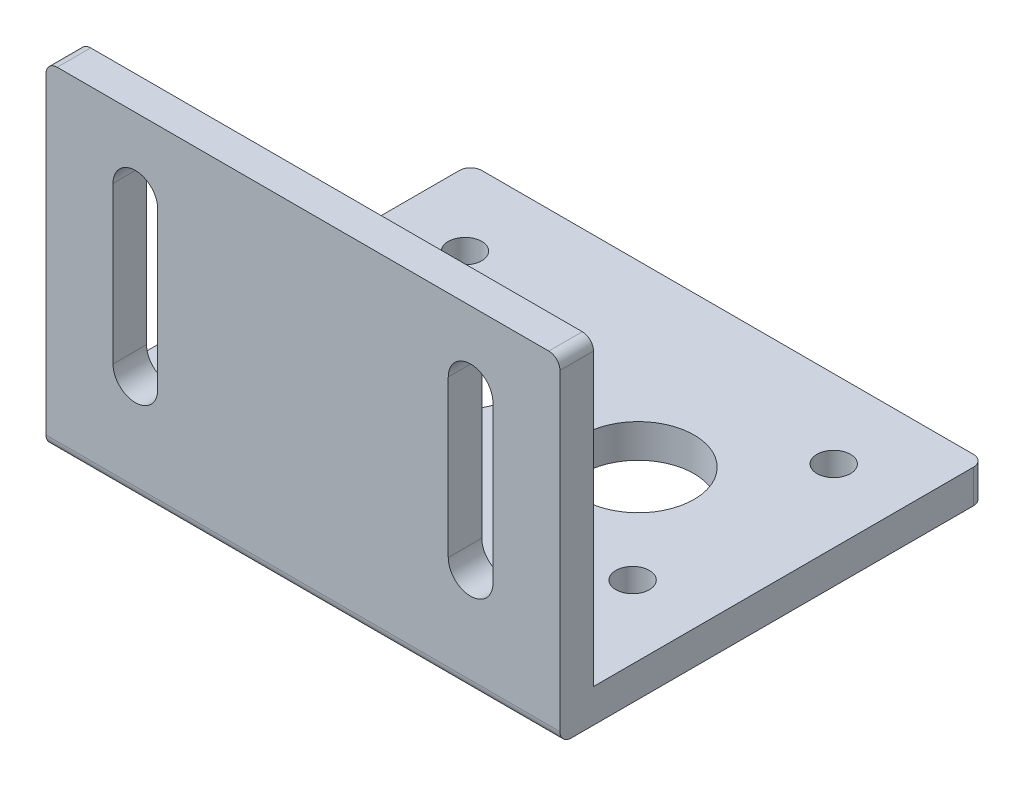
ISO-10303-21;
HEADER;
FILE_DESCRIPTION(('STEP AP214'),'2;1');
FILE_NAME('part.step','',(''),(''),'','','');
FILE_SCHEMA(('AUTOMOTIVE_DESIGN { 1 0 10303 214 1 1 1 1 }'));
ENDSEC;
DATA;
#1=APPLICATION_CONTEXT('core data for automotive mechanical design processes');
#2=APPLICATION_PROTOCOL_DEFINITION('international standard','automotive_design',2000,#1);
#3=PRODUCT_CONTEXT('',#1,'mechanical');
#4=PRODUCT('Part','Part','',(#3));
#5=PRODUCT_RELATED_PRODUCT_CATEGORY('part','',(#4));
#6=PRODUCT_DEFINITION_FORMATION('','',#4);
#7=PRODUCT_DEFINITION_CONTEXT('part definition',#1,'design');
#8=PRODUCT_DEFINITION('design','',#6,#7);
#9=PRODUCT_DEFINITION_SHAPE('','',#8);
#10=(LENGTH_UNIT() NAMED_UNIT(*) SI_UNIT(.MILLI.,.METRE.));
#11=(NAMED_UNIT(*) PLANE_ANGLE_UNIT() SI_UNIT($,.RADIAN.));
#12=(NAMED_UNIT(*) SI_UNIT($,.STERADIAN.) SOLID_ANGLE_UNIT());
#13=UNCERTAINTY_MEASURE_WITH_UNIT(LENGTH_MEASURE(1.E-05),#10,'distance_accuracy_value','');
#14=(GEOMETRIC_REPRESENTATION_CONTEXT(3) GLOBAL_UNCERTAINTY_ASSIGNED_CONTEXT((#13)) GLOBAL_UNIT_ASSIGNED_CONTEXT((#10,
#11,#12)) REPRESENTATION_CONTEXT('',''));
#15=CARTESIAN_POINT('',(0.,0.,0.));
#16=DIRECTION('',(0.,0.,1.));
#17=DIRECTION('',(1.,0.,0.));
#18=AXIS2_PLACEMENT_3D('',#15,#16,#17);
#19=CARTESIAN_POINT('',(-22.,3.,-18.));
#20=DIRECTION('',(0.,1.,0.));
#21=DIRECTION('',(0.,0.,1.));
#22=AXIS2_PLACEMENT_3D('',#19,#20,#21);
#23=PLANE('',#22);
#24=DIRECTION('',(-1.,0.,0.));
#25=VECTOR('',#24,1.);
#26=CARTESIAN_POINT('',(-23.,3.,16.));
#27=LINE('',#26,#25);
#28=CARTESIAN_POINT('',(23.,3.,16.));
#29=VERTEX_POINT('',#28);
#30=CARTESIAN_POINT('',(-23.,3.,16.));
#31=VERTEX_POINT('',#30);
#32=EDGE_CURVE('E204',#29,#31,#27,.T.);
#33=ORIENTED_EDGE('',*,*,#32,.F.);
#34=DIRECTION('',(0.,0.,-1.));
#35=VECTOR('',#34,1.);
#36=CARTESIAN_POINT('',(23.,3.,-18.));
#37=LINE('',#36,#35);
#38=CARTESIAN_POINT('',(23.,3.,-18.));
#39=VERTEX_POINT('',#38);
#40=EDGE_CURVE('E288',#29,#39,#37,.T.);
#41=ORIENTED_EDGE('',*,*,#40,.T.);
#42=CARTESIAN_POINT('',(22.,3.,-18.));
#43=DIRECTION('',(0.,1.,0.));
#44=DIRECTION('',(0.,0.,1.));
#45=AXIS2_PLACEMENT_3D('',#42,#43,#44);
#46=CIRCLE('',#45,1.00000000000001);
#47=CARTESIAN_POINT('',(22.,3.,-19.));
#48=VERTEX_POINT('',#47);
#49=EDGE_CURVE('E290',#39,#48,#46,.T.);
#50=ORIENTED_EDGE('',*,*,#49,.T.);
#51=DIRECTION('',(-1.,0.,0.));
#52=VECTOR('',#51,1.);
#53=CARTESIAN_POINT('',(-22.,3.,-19.));
#54=LINE('',#53,#52);
#55=CARTESIAN_POINT('',(-22.,3.,-19.));
#56=VERTEX_POINT('',#55);
#57=EDGE_CURVE('E293',#48,#56,#54,.T.);
#58=ORIENTED_EDGE('',*,*,#57,.T.);
#59=CARTESIAN_POINT('',(-22.,3.,-18.));
#60=DIRECTION('',(0.,1.,0.));
#61=DIRECTION('',(0.,0.,1.));
#62=AXIS2_PLACEMENT_3D('',#59,#60,#61);
#63=CIRCLE('',#62,1.00000000000001);
#64=CARTESIAN_POINT('',(-23.,3.,-18.));
#65=VERTEX_POINT('',#64);
#66=EDGE_CURVE('E295',#56,#65,#63,.T.);
#67=ORIENTED_EDGE('',*,*,#66,.T.);
#68=DIRECTION('',(0.,0.,1.));
#69=VECTOR('',#68,1.);
#70=CARTESIAN_POINT('',(-23.,3.,-18.));
#71=LINE('',#70,#69);
#72=EDGE_CURVE('E297',#65,#31,#71,.T.);
#73=ORIENTED_EDGE('',*,*,#72,.T.);
#74=EDGE_LOOP('',(#33,#41,#50,#58,#67,#73));
#75=FACE_BOUND('',#74,.T.);
#76=CARTESIAN_POINT('',(16.5,3.,5.99999999999998));
#77=DIRECTION('',(0.,1.,0.));
#78=DIRECTION('',(0.,0.,1.));
#79=AXIS2_PLACEMENT_3D('',#76,#77,#78);
#80=CIRCLE('',#79,1.5);
#81=CARTESIAN_POINT('',(16.5,3.,7.49999999999998));
#82=VERTEX_POINT('',#81);
#83=EDGE_CURVE('E258',#82,#82,#80,.T.);
#84=ORIENTED_EDGE('',*,*,#83,.F.);
#85=EDGE_LOOP('',(#84));
#86=FACE_BOUND('',#85,.T.);
#87=CARTESIAN_POINT('',(-16.5,3.,-12.));
#88=DIRECTION('',(0.,1.,0.));
#89=DIRECTION('',(0.,0.,1.));
#90=AXIS2_PLACEMENT_3D('',#87,#88,#89);
#91=CIRCLE('',#90,1.5);
#92=CARTESIAN_POINT('',(-16.5,3.,-10.5));
#93=VERTEX_POINT('',#92);
#94=EDGE_CURVE('E270',#93,#93,#91,.T.);
#95=ORIENTED_EDGE('',*,*,#94,.F.);
#96=EDGE_LOOP('',(#95));
#97=FACE_BOUND('',#96,.T.);
#98=CARTESIAN_POINT('',(8.00000000000001,3.,-3.00000000000003));
#99=DIRECTION('',(0.,1.,0.));
#100=DIRECTION('',(0.,0.,1.));
#101=AXIS2_PLACEMENT_3D('',#98,#99,#100);
#102=CIRCLE('',#101,5.);
#103=CARTESIAN_POINT('',(8.00000000000001,3.,1.99999999999997));
#104=VERTEX_POINT('',#103);
#105=EDGE_CURVE('E282',#104,#104,#102,.T.);
#106=ORIENTED_EDGE('',*,*,#105,.F.);
#107=EDGE_LOOP('',(#106));
#108=FACE_BOUND('',#107,.T.);
#109=CARTESIAN_POINT('',(-8.,3.,-3.00000000000003));
#110=DIRECTION('',(0.,1.,0.));
#111=DIRECTION('',(0.,0.,-1.));
#112=AXIS2_PLACEMENT_3D('',#109,#110,#111);
#113=CIRCLE('',#112,5.);
#114=CARTESIAN_POINT('',(-8.,3.,-8.00000000000003));
#115=VERTEX_POINT('',#114);
#116=EDGE_CURVE('E276',#115,#115,#113,.T.);
#117=ORIENTED_EDGE('',*,*,#116,.F.);
#118=EDGE_LOOP('',(#117));
#119=FACE_BOUND('',#118,.T.);
#120=CARTESIAN_POINT('',(-16.5,3.,5.99999999999998));
#121=DIRECTION('',(0.,1.,0.));
#122=DIRECTION('',(0.,0.,-1.));
#123=AXIS2_PLACEMENT_3D('',#120,#121,#122);
#124=CIRCLE('',#123,1.5);
#125=CARTESIAN_POINT('',(-16.5,3.,4.49999999999998));
#126=VERTEX_POINT('',#125);
#127=EDGE_CURVE('E264',#126,#126,#124,.T.);
#128=ORIENTED_EDGE('',*,*,#127,.F.);
#129=EDGE_LOOP('',(#128));
#130=FACE_BOUND('',#129,.T.);
#131=CARTESIAN_POINT('',(16.5,3.,-12.));
#132=DIRECTION('',(0.,1.,0.));
#133=DIRECTION('',(0.,0.,-1.));
#134=AXIS2_PLACEMENT_3D('',#131,#132,#133);
#135=CIRCLE('',#134,1.5);
#136=CARTESIAN_POINT('',(16.5,3.,-13.5));
#137=VERTEX_POINT('',#136);
#138=EDGE_CURVE('E252',#137,#137,#135,.T.);
#139=ORIENTED_EDGE('',*,*,#138,.F.);
#140=EDGE_LOOP('',(#139));
#141=FACE_BOUND('',#140,.T.);
#142=ADVANCED_FACE('F33',(#75,#86,#97,#108,#119,#130,#141),#23,.T.);
#143=CARTESIAN_POINT('',(-22.,0.,-18.));
#144=DIRECTION('',(0.,1.,0.));
#145=DIRECTION('',(0.,0.,1.));
#146=AXIS2_PLACEMENT_3D('',#143,#144,#145);
#147=PLANE('',#146);
#148=DIRECTION('',(0.,0.,-1.));
#149=VECTOR('',#148,1.);
#150=CARTESIAN_POINT('',(23.,0.,-18.));
#151=LINE('',#150,#149);
#152=CARTESIAN_POINT('',(23.,0.,18.));
#153=VERTEX_POINT('',#152);
#154=CARTESIAN_POINT('',(23.,0.,-18.));
#155=VERTEX_POINT('',#154);
#156=EDGE_CURVE('E285',#153,#155,#151,.T.);
#157=ORIENTED_EDGE('',*,*,#156,.F.);
#158=DIRECTION('',(1.,0.,0.));
#159=VECTOR('',#158,1.);
#160=CARTESIAN_POINT('',(-22.,0.,18.));
#161=LINE('',#160,#159);
#162=CARTESIAN_POINT('',(-23.,0.,18.));
#163=VERTEX_POINT('',#162);
#164=EDGE_CURVE('E41',#153,#163,#161,.F.);
#165=ORIENTED_EDGE('',*,*,#164,.T.);
#166=DIRECTION('',(0.,0.,1.));
#167=VECTOR('',#166,1.);
#168=CARTESIAN_POINT('',(-23.,0.,-18.));
#169=LINE('',#168,#167);
#170=CARTESIAN_POINT('',(-23.,0.,-18.));
#171=VERTEX_POINT('',#170);
#172=EDGE_CURVE('E291',#171,#163,#169,.T.);
#173=ORIENTED_EDGE('',*,*,#172,.F.);
#174=CARTESIAN_POINT('',(-22.,0.,-18.));
#175=DIRECTION('',(0.,1.,0.));
#176=DIRECTION('',(0.,0.,1.));
#177=AXIS2_PLACEMENT_3D('',#174,#175,#176);
#178=CIRCLE('',#177,1.00000000000001);
#179=CARTESIAN_POINT('',(-22.,0.,-19.));
#180=VERTEX_POINT('',#179);
#181=EDGE_CURVE('E306',#180,#171,#178,.T.);
#182=ORIENTED_EDGE('',*,*,#181,.F.);
#183=DIRECTION('',(-1.,0.,0.));
#184=VECTOR('',#183,1.);
#185=CARTESIAN_POINT('',(-22.,0.,-19.));
#186=LINE('',#185,#184);
#187=CARTESIAN_POINT('',(22.,0.,-19.));
#188=VERTEX_POINT('',#187);
#189=EDGE_CURVE('E304',#188,#180,#186,.T.);
#190=ORIENTED_EDGE('',*,*,#189,.F.);
#191=CARTESIAN_POINT('',(22.,0.,-18.));
#192=DIRECTION('',(0.,1.,0.));
#193=DIRECTION('',(0.,0.,1.));
#194=AXIS2_PLACEMENT_3D('',#191,#192,#193);
#195=CIRCLE('',#194,1.00000000000001);
#196=EDGE_CURVE('E302',#155,#188,#195,.T.);
#197=ORIENTED_EDGE('',*,*,#196,.F.);
#198=EDGE_LOOP('',(#157,#165,#173,#182,#190,#197));
#199=FACE_BOUND('',#198,.T.);
#200=CARTESIAN_POINT('',(8.00000000000001,0.,-3.00000000000003));
#201=DIRECTION('',(0.,1.,0.));
#202=DIRECTION('',(0.,0.,1.));
#203=AXIS2_PLACEMENT_3D('',#200,#201,#202);
#204=CIRCLE('',#203,5.);
#205=CARTESIAN_POINT('',(8.00000000000001,0.,1.99999999999997));
#206=VERTEX_POINT('',#205);
#207=EDGE_CURVE('E279',#206,#206,#204,.T.);
#208=ORIENTED_EDGE('',*,*,#207,.T.);
#209=EDGE_LOOP('',(#208));
#210=FACE_BOUND('',#209,.T.);
#211=CARTESIAN_POINT('',(-8.,0.,-3.00000000000003));
#212=DIRECTION('',(0.,1.,0.));
#213=DIRECTION('',(0.,0.,-1.));
#214=AXIS2_PLACEMENT_3D('',#211,#212,#213);
#215=CIRCLE('',#214,5.);
#216=CARTESIAN_POINT('',(-8.,0.,-8.00000000000003));
#217=VERTEX_POINT('',#216);
#218=EDGE_CURVE('E273',#217,#217,#215,.T.);
#219=ORIENTED_EDGE('',*,*,#218,.T.);
#220=EDGE_LOOP('',(#219));
#221=FACE_BOUND('',#220,.T.);
#222=CARTESIAN_POINT('',(-16.5,0.,-12.));
#223=DIRECTION('',(0.,1.,0.));
#224=DIRECTION('',(0.,0.,1.));
#225=AXIS2_PLACEMENT_3D('',#222,#223,#224);
#226=CIRCLE('',#225,1.5);
#227=CARTESIAN_POINT('',(-16.5,0.,-10.5));
#228=VERTEX_POINT('',#227);
#229=EDGE_CURVE('E267',#228,#228,#226,.T.);
#230=ORIENTED_EDGE('',*,*,#229,.T.);
#231=EDGE_LOOP('',(#230));
#232=FACE_BOUND('',#231,.T.);
#233=CARTESIAN_POINT('',(-16.5,0.,5.99999999999998));
#234=DIRECTION('',(0.,1.,0.));
#235=DIRECTION('',(0.,0.,-1.));
#236=AXIS2_PLACEMENT_3D('',#233,#234,#235);
#237=CIRCLE('',#236,1.5);
#238=CARTESIAN_POINT('',(-16.5,0.,4.49999999999998));
#239=VERTEX_POINT('',#238);
#240=EDGE_CURVE('E261',#239,#239,#237,.T.);
#241=ORIENTED_EDGE('',*,*,#240,.T.);
#242=EDGE_LOOP('',(#241));
#243=FACE_BOUND('',#242,.T.);
#244=CARTESIAN_POINT('',(16.5,0.,5.99999999999998));
#245=DIRECTION('',(0.,1.,0.));
#246=DIRECTION('',(0.,0.,1.));
#247=AXIS2_PLACEMENT_3D('',#244,#245,#246);
#248=CIRCLE('',#247,1.5);
#249=CARTESIAN_POINT('',(16.5,0.,7.49999999999998));
#250=VERTEX_POINT('',#249);
#251=EDGE_CURVE('E255',#250,#250,#248,.T.);
#252=ORIENTED_EDGE('',*,*,#251,.T.);
#253=EDGE_LOOP('',(#252));
#254=FACE_BOUND('',#253,.T.);
#255=CARTESIAN_POINT('',(16.5,0.,-12.));
#256=DIRECTION('',(0.,1.,0.));
#257=DIRECTION('',(0.,0.,-1.));
#258=AXIS2_PLACEMENT_3D('',#255,#256,#257);
#259=CIRCLE('',#258,1.5);
#260=CARTESIAN_POINT('',(16.5,0.,-13.5));
#261=VERTEX_POINT('',#260);
#262=EDGE_CURVE('E251',#261,#261,#259,.T.);
#263=ORIENTED_EDGE('',*,*,#262,.T.);
#264=EDGE_LOOP('',(#263));
#265=FACE_BOUND('',#264,.T.);
#266=ADVANCED_FACE('F377',(#199,#210,#221,#232,#243,#254,#265),#147,.F.);
#267=CARTESIAN_POINT('',(23.,3.,-18.));
#268=DIRECTION('',(-1.,0.,0.));
#269=DIRECTION('',(0.,0.,1.));
#270=AXIS2_PLACEMENT_3D('',#267,#268,#269);
#271=PLANE('',#270);
#272=DIRECTION('',(0.,-1.,0.));
#273=VECTOR('',#272,1.);
#274=CARTESIAN_POINT('',(23.,3.,19.));
#275=LINE('',#274,#273);
#276=CARTESIAN_POINT('',(23.,29.,19.));
#277=VERTEX_POINT('',#276);
#278=CARTESIAN_POINT('',(23.,1.,19.));
#279=VERTEX_POINT('',#278);
#280=EDGE_CURVE('E300',#277,#279,#275,.T.);
#281=ORIENTED_EDGE('',*,*,#280,.T.);
#282=CARTESIAN_POINT('',(23.,1.,18.));
#283=DIRECTION('',(-1.,0.,0.));
#284=DIRECTION('',(0.,0.,1.));
#285=AXIS2_PLACEMENT_3D('',#282,#283,#284);
#286=CIRCLE('',#285,1.);
#287=EDGE_CURVE('E55',#279,#153,#286,.F.);
#288=ORIENTED_EDGE('',*,*,#287,.T.);
#289=ORIENTED_EDGE('',*,*,#156,.T.);
#290=DIRECTION('',(0.,-1.,0.));
#291=VECTOR('',#290,1.);
#292=CARTESIAN_POINT('',(23.,3.,-18.));
#293=LINE('',#292,#291);
#294=EDGE_CURVE('E322',#39,#155,#293,.T.);
#295=ORIENTED_EDGE('',*,*,#294,.F.);
#296=ORIENTED_EDGE('',*,*,#40,.F.);
#297=DIRECTION('',(0.,-1.,0.));
#298=VECTOR('',#297,1.);
#299=CARTESIAN_POINT('',(23.,30.,16.));
#300=LINE('',#299,#298);
#301=CARTESIAN_POINT('',(23.,29.,16.));
#302=VERTEX_POINT('',#301);
#303=EDGE_CURVE('E249',#302,#29,#300,.T.);
#304=ORIENTED_EDGE('',*,*,#303,.F.);
#305=DIRECTION('',(0.,0.,-1.));
#306=VECTOR('',#305,1.);
#307=CARTESIAN_POINT('',(23.,29.,-18.));
#308=LINE('',#307,#306);
#309=EDGE_CURVE('E341',#302,#277,#308,.F.);
#310=ORIENTED_EDGE('',*,*,#309,.T.);
#311=EDGE_LOOP('',(#281,#288,#289,#295,#296,#304,#310));
#312=FACE_BOUND('',#311,.T.);
#313=ADVANCED_FACE('F353',(#312),#271,.F.);
#314=CARTESIAN_POINT('',(22.,3.,-18.));
#315=DIRECTION('',(0.,-1.,0.));
#316=DIRECTION('',(0.,0.,-1.));
#317=AXIS2_PLACEMENT_3D('',#314,#315,#316);
#318=CYLINDRICAL_SURFACE('',#317,1.00000000000001);
#319=ORIENTED_EDGE('',*,*,#196,.T.);
#320=DIRECTION('',(0.,-1.,0.));
#321=VECTOR('',#320,1.);
#322=CARTESIAN_POINT('',(22.,3.,-19.));
#323=LINE('',#322,#321);
#324=EDGE_CURVE('E319',#48,#188,#323,.T.);
#325=ORIENTED_EDGE('',*,*,#324,.F.);
#326=ORIENTED_EDGE('',*,*,#49,.F.);
#327=ORIENTED_EDGE('',*,*,#294,.T.);
#328=EDGE_LOOP('',(#319,#325,#326,#327));
#329=FACE_BOUND('',#328,.T.);
#330=ADVANCED_FACE('F401',(#329),#318,.T.);
#331=CARTESIAN_POINT('',(-22.,3.,-19.));
#332=DIRECTION('',(0.,0.,1.));
#333=DIRECTION('',(1.,0.,0.));
#334=AXIS2_PLACEMENT_3D('',#331,#332,#333);
#335=PLANE('',#334);
#336=ORIENTED_EDGE('',*,*,#189,.T.);
#337=DIRECTION('',(0.,-1.,0.));
#338=VECTOR('',#337,1.);
#339=CARTESIAN_POINT('',(-22.,3.,-19.));
#340=LINE('',#339,#338);
#341=EDGE_CURVE('E316',#56,#180,#340,.T.);
#342=ORIENTED_EDGE('',*,*,#341,.F.);
#343=ORIENTED_EDGE('',*,*,#57,.F.);
#344=ORIENTED_EDGE('',*,*,#324,.T.);
#345=EDGE_LOOP('',(#336,#342,#343,#344));
#346=FACE_BOUND('',#345,.T.);
#347=ADVANCED_FACE('F397',(#346),#335,.F.);
#348=CARTESIAN_POINT('',(-22.,3.,-18.));
#349=DIRECTION('',(0.,-1.,0.));
#350=DIRECTION('',(0.,0.,-1.));
#351=AXIS2_PLACEMENT_3D('',#348,#349,#350);
#352=CYLINDRICAL_SURFACE('',#351,1.00000000000001);
#353=ORIENTED_EDGE('',*,*,#181,.T.);
#354=DIRECTION('',(0.,-1.,0.));
#355=VECTOR('',#354,1.);
#356=CARTESIAN_POINT('',(-23.,3.,-18.));
#357=LINE('',#356,#355);
#358=EDGE_CURVE('E313',#65,#171,#357,.T.);
#359=ORIENTED_EDGE('',*,*,#358,.F.);
#360=ORIENTED_EDGE('',*,*,#66,.F.);
#361=ORIENTED_EDGE('',*,*,#341,.T.);
#362=EDGE_LOOP('',(#353,#359,#360,#361));
#363=FACE_BOUND('',#362,.T.);
#364=ADVANCED_FACE('F394',(#363),#352,.T.);
#365=CARTESIAN_POINT('',(-23.,3.,-18.));
#366=DIRECTION('',(1.,0.,0.));
#367=DIRECTION('',(0.,0.,-1.));
#368=AXIS2_PLACEMENT_3D('',#365,#366,#367);
#369=PLANE('',#368);
#370=ORIENTED_EDGE('',*,*,#172,.T.);
#371=CARTESIAN_POINT('',(-23.,1.,18.));
#372=DIRECTION('',(1.,0.,0.));
#373=DIRECTION('',(0.,0.,-1.));
#374=AXIS2_PLACEMENT_3D('',#371,#372,#373);
#375=CIRCLE('',#374,1.);
#376=CARTESIAN_POINT('',(-23.,1.,19.));
#377=VERTEX_POINT('',#376);
#378=EDGE_CURVE('E11',#163,#377,#375,.F.);
#379=ORIENTED_EDGE('',*,*,#378,.T.);
#380=DIRECTION('',(0.,-1.,0.));
#381=VECTOR('',#380,1.);
#382=CARTESIAN_POINT('',(-23.,3.,19.));
#383=LINE('',#382,#381);
#384=CARTESIAN_POINT('',(-23.,29.,19.));
#385=VERTEX_POINT('',#384);
#386=EDGE_CURVE('E310',#385,#377,#383,.T.);
#387=ORIENTED_EDGE('',*,*,#386,.F.);
#388=DIRECTION('',(0.,0.,1.));
#389=VECTOR('',#388,1.);
#390=CARTESIAN_POINT('',(-23.,29.,-18.));
#391=LINE('',#390,#389);
#392=CARTESIAN_POINT('',(-23.,29.,16.));
#393=VERTEX_POINT('',#392);
#394=EDGE_CURVE('E335',#385,#393,#391,.F.);
#395=ORIENTED_EDGE('',*,*,#394,.T.);
#396=DIRECTION('',(0.,-1.,0.));
#397=VECTOR('',#396,1.);
#398=CARTESIAN_POINT('',(-23.,30.,16.));
#399=LINE('',#398,#397);
#400=EDGE_CURVE('E245',#393,#31,#399,.T.);
#401=ORIENTED_EDGE('',*,*,#400,.T.);
#402=ORIENTED_EDGE('',*,*,#72,.F.);
#403=ORIENTED_EDGE('',*,*,#358,.T.);
#404=EDGE_LOOP('',(#370,#379,#387,#395,#401,#402,#403));
#405=FACE_BOUND('',#404,.T.);
#406=ADVANCED_FACE('F370',(#405),#369,.F.);
#407=CARTESIAN_POINT('',(-23.,3.,19.));
#408=DIRECTION('',(0.,0.,-1.));
#409=DIRECTION('',(-1.,0.,0.));
#410=AXIS2_PLACEMENT_3D('',#407,#408,#409);
#411=PLANE('',#410);
#412=DIRECTION('',(0.,1.,0.));
#413=VECTOR('',#412,1.);
#414=CARTESIAN_POINT('',(-17.,23.5,19.));
#415=LINE('',#414,#413);
#416=CARTESIAN_POINT('',(-17.,9.50000000000003,19.));
#417=VERTEX_POINT('',#416);
#418=CARTESIAN_POINT('',(-17.,23.5,19.));
#419=VERTEX_POINT('',#418);
#420=EDGE_CURVE('E175',#417,#419,#415,.T.);
#421=ORIENTED_EDGE('',*,*,#420,.T.);
#422=CARTESIAN_POINT('',(-15.,23.5,19.));
#423=DIRECTION('',(0.,0.,-1.));
#424=DIRECTION('',(1.,0.,0.));
#425=AXIS2_PLACEMENT_3D('',#422,#423,#424);
#426=CIRCLE('',#425,2.);
#427=CARTESIAN_POINT('',(-13.,23.5,19.));
#428=VERTEX_POINT('',#427);
#429=EDGE_CURVE('E167',#419,#428,#426,.T.);
#430=ORIENTED_EDGE('',*,*,#429,.T.);
#431=DIRECTION('',(0.,-1.,0.));
#432=VECTOR('',#431,1.);
#433=CARTESIAN_POINT('',(-13.,23.5,19.));
#434=LINE('',#433,#432);
#435=CARTESIAN_POINT('',(-13.,9.50000000000002,19.));
#436=VERTEX_POINT('',#435);
#437=EDGE_CURVE('E179',#428,#436,#434,.T.);
#438=ORIENTED_EDGE('',*,*,#437,.T.);
#439=CARTESIAN_POINT('',(-15.,9.50000000000003,19.));
#440=DIRECTION('',(0.,0.,-1.));
#441=DIRECTION('',(-1.,0.,0.));
#442=AXIS2_PLACEMENT_3D('',#439,#440,#441);
#443=CIRCLE('',#442,2.);
#444=EDGE_CURVE('E183',#436,#417,#443,.T.);
#445=ORIENTED_EDGE('',*,*,#444,.T.);
#446=EDGE_LOOP('',(#421,#430,#438,#445));
#447=FACE_BOUND('',#446,.T.);
#448=DIRECTION('',(0.,1.,0.));
#449=VECTOR('',#448,1.);
#450=CARTESIAN_POINT('',(13.,23.5,19.));
#451=LINE('',#450,#449);
#452=CARTESIAN_POINT('',(13.,9.5,19.));
#453=VERTEX_POINT('',#452);
#454=CARTESIAN_POINT('',(13.,23.5,19.));
#455=VERTEX_POINT('',#454);
#456=EDGE_CURVE('E218',#453,#455,#451,.T.);
#457=ORIENTED_EDGE('',*,*,#456,.T.);
#458=CARTESIAN_POINT('',(15.,23.5,19.));
#459=DIRECTION('',(0.,0.,-1.));
#460=DIRECTION('',(-1.,0.,0.));
#461=AXIS2_PLACEMENT_3D('',#458,#459,#460);
#462=CIRCLE('',#461,2.);
#463=CARTESIAN_POINT('',(17.,23.5,19.));
#464=VERTEX_POINT('',#463);
#465=EDGE_CURVE('E208',#455,#464,#462,.T.);
#466=ORIENTED_EDGE('',*,*,#465,.T.);
#467=DIRECTION('',(0.,-1.,0.));
#468=VECTOR('',#467,1.);
#469=CARTESIAN_POINT('',(17.,23.5,19.));
#470=LINE('',#469,#468);
#471=CARTESIAN_POINT('',(17.,9.5,19.));
#472=VERTEX_POINT('',#471);
#473=EDGE_CURVE('E211',#464,#472,#470,.T.);
#474=ORIENTED_EDGE('',*,*,#473,.T.);
#475=CARTESIAN_POINT('',(15.,9.5,19.));
#476=DIRECTION('',(0.,0.,-1.));
#477=DIRECTION('',(1.,0.,0.));
#478=AXIS2_PLACEMENT_3D('',#475,#476,#477);
#479=CIRCLE('',#478,2.);
#480=EDGE_CURVE('E215',#472,#453,#479,.T.);
#481=ORIENTED_EDGE('',*,*,#480,.T.);
#482=EDGE_LOOP('',(#457,#466,#474,#481));
#483=FACE_BOUND('',#482,.T.);
#484=ORIENTED_EDGE('',*,*,#386,.T.);
#485=DIRECTION('',(1.,0.,0.));
#486=VECTOR('',#485,1.);
#487=CARTESIAN_POINT('',(-23.,1.,19.));
#488=LINE('',#487,#486);
#489=EDGE_CURVE('E343',#377,#279,#488,.T.);
#490=ORIENTED_EDGE('',*,*,#489,.T.);
#491=ORIENTED_EDGE('',*,*,#280,.F.);
#492=CARTESIAN_POINT('',(22.,29.,19.));
#493=DIRECTION('',(0.,0.,-1.));
#494=DIRECTION('',(-1.,0.,0.));
#495=AXIS2_PLACEMENT_3D('',#492,#493,#494);
#496=CIRCLE('',#495,1.);
#497=CARTESIAN_POINT('',(22.,30.,19.));
#498=VERTEX_POINT('',#497);
#499=EDGE_CURVE('E331',#277,#498,#496,.F.);
#500=ORIENTED_EDGE('',*,*,#499,.T.);
#501=DIRECTION('',(1.,0.,0.));
#502=VECTOR('',#501,1.);
#503=CARTESIAN_POINT('',(-23.,30.,19.));
#504=LINE('',#503,#502);
#505=CARTESIAN_POINT('',(-22.,30.,19.));
#506=VERTEX_POINT('',#505);
#507=EDGE_CURVE('E239',#506,#498,#504,.T.);
#508=ORIENTED_EDGE('',*,*,#507,.F.);
#509=CARTESIAN_POINT('',(-22.,29.,19.));
#510=DIRECTION('',(0.,0.,-1.));
#511=DIRECTION('',(-1.,0.,0.));
#512=AXIS2_PLACEMENT_3D('',#509,#510,#511);
#513=CIRCLE('',#512,1.);
#514=EDGE_CURVE('E333',#506,#385,#513,.F.);
#515=ORIENTED_EDGE('',*,*,#514,.T.);
#516=EDGE_LOOP('',(#484,#490,#491,#500,#508,#515));
#517=FACE_BOUND('',#516,.T.);
#518=ADVANCED_FACE('F185',(#447,#483,#517),#411,.F.);
#519=CARTESIAN_POINT('',(8.00000000000001,3.,-3.00000000000003));
#520=DIRECTION('',(0.,-1.,0.));
#521=DIRECTION('',(0.,0.,-1.));
#522=AXIS2_PLACEMENT_3D('',#519,#520,#521);
#523=CYLINDRICAL_SURFACE('',#522,5.);
#524=ORIENTED_EDGE('',*,*,#105,.T.);
#525=EDGE_LOOP('',(#524));
#526=FACE_BOUND('',#525,.T.);
#527=ORIENTED_EDGE('',*,*,#207,.F.);
#528=EDGE_LOOP('',(#527));
#529=FACE_BOUND('',#528,.T.);
#530=ADVANCED_FACE('F387',(#526,#529),#523,.F.);
#531=CARTESIAN_POINT('',(-8.,3.,-3.00000000000003));
#532=DIRECTION('',(0.,-1.,0.));
#533=DIRECTION('',(0.,0.,-1.));
#534=AXIS2_PLACEMENT_3D('',#531,#532,#533);
#535=CYLINDRICAL_SURFACE('',#534,5.);
#536=ORIENTED_EDGE('',*,*,#116,.T.);
#537=EDGE_LOOP('',(#536));
#538=FACE_BOUND('',#537,.T.);
#539=ORIENTED_EDGE('',*,*,#218,.F.);
#540=EDGE_LOOP('',(#539));
#541=FACE_BOUND('',#540,.T.);
#542=ADVANCED_FACE('F460',(#538,#541),#535,.F.);
#543=CARTESIAN_POINT('',(-16.5,3.,-12.));
#544=DIRECTION('',(0.,-1.,0.));
#545=DIRECTION('',(0.,0.,-1.));
#546=AXIS2_PLACEMENT_3D('',#543,#544,#545);
#547=CYLINDRICAL_SURFACE('',#546,1.5);
#548=ORIENTED_EDGE('',*,*,#94,.T.);
#549=EDGE_LOOP('',(#548));
#550=FACE_BOUND('',#549,.T.);
#551=ORIENTED_EDGE('',*,*,#229,.F.);
#552=EDGE_LOOP('',(#551));
#553=FACE_BOUND('',#552,.T.);
#554=ADVANCED_FACE('F457',(#550,#553),#547,.F.);
#555=CARTESIAN_POINT('',(-16.5,3.,5.99999999999998));
#556=DIRECTION('',(0.,-1.,0.));
#557=DIRECTION('',(0.,0.,-1.));
#558=AXIS2_PLACEMENT_3D('',#555,#556,#557);
#559=CYLINDRICAL_SURFACE('',#558,1.5);
#560=ORIENTED_EDGE('',*,*,#127,.T.);
#561=EDGE_LOOP('',(#560));
#562=FACE_BOUND('',#561,.T.);
#563=ORIENTED_EDGE('',*,*,#240,.F.);
#564=EDGE_LOOP('',(#563));
#565=FACE_BOUND('',#564,.T.);
#566=ADVANCED_FACE('F453',(#562,#565),#559,.F.);
#567=CARTESIAN_POINT('',(16.5,3.,5.99999999999998));
#568=DIRECTION('',(0.,-1.,0.));
#569=DIRECTION('',(0.,0.,-1.));
#570=AXIS2_PLACEMENT_3D('',#567,#568,#569);
#571=CYLINDRICAL_SURFACE('',#570,1.5);
#572=ORIENTED_EDGE('',*,*,#83,.T.);
#573=EDGE_LOOP('',(#572));
#574=FACE_BOUND('',#573,.T.);
#575=ORIENTED_EDGE('',*,*,#251,.F.);
#576=EDGE_LOOP('',(#575));
#577=FACE_BOUND('',#576,.T.);
#578=ADVANCED_FACE('F449',(#574,#577),#571,.F.);
#579=CARTESIAN_POINT('',(16.5,3.,-12.));
#580=DIRECTION('',(0.,-1.,0.));
#581=DIRECTION('',(0.,0.,-1.));
#582=AXIS2_PLACEMENT_3D('',#579,#580,#581);
#583=CYLINDRICAL_SURFACE('',#582,1.5);
#584=ORIENTED_EDGE('',*,*,#138,.T.);
#585=EDGE_LOOP('',(#584));
#586=FACE_BOUND('',#585,.T.);
#587=ORIENTED_EDGE('',*,*,#262,.F.);
#588=EDGE_LOOP('',(#587));
#589=FACE_BOUND('',#588,.T.);
#590=ADVANCED_FACE('F445',(#586,#589),#583,.F.);
#591=CARTESIAN_POINT('',(-23.,30.,16.));
#592=DIRECTION('',(0.,0.,1.));
#593=DIRECTION('',(1.,0.,0.));
#594=AXIS2_PLACEMENT_3D('',#591,#592,#593);
#595=PLANE('',#594);
#596=DIRECTION('',(0.,-1.,0.));
#597=VECTOR('',#596,1.);
#598=CARTESIAN_POINT('',(-13.,23.5,16.));
#599=LINE('',#598,#597);
#600=CARTESIAN_POINT('',(-13.,23.5,16.));
#601=VERTEX_POINT('',#600);
#602=CARTESIAN_POINT('',(-13.,9.50000000000002,16.));
#603=VERTEX_POINT('',#602);
#604=EDGE_CURVE('E197',#601,#603,#599,.T.);
#605=ORIENTED_EDGE('',*,*,#604,.F.);
#606=CARTESIAN_POINT('',(-15.,23.5,16.));
#607=DIRECTION('',(0.,0.,-1.));
#608=DIRECTION('',(1.,0.,0.));
#609=AXIS2_PLACEMENT_3D('',#606,#607,#608);
#610=CIRCLE('',#609,2.);
#611=CARTESIAN_POINT('',(-17.,23.5,16.));
#612=VERTEX_POINT('',#611);
#613=EDGE_CURVE('E170',#612,#601,#610,.T.);
#614=ORIENTED_EDGE('',*,*,#613,.F.);
#615=DIRECTION('',(0.,1.,0.));
#616=VECTOR('',#615,1.);
#617=CARTESIAN_POINT('',(-17.,23.5,16.));
#618=LINE('',#617,#616);
#619=CARTESIAN_POINT('',(-17.,9.50000000000003,16.));
#620=VERTEX_POINT('',#619);
#621=EDGE_CURVE('E188',#620,#612,#618,.T.);
#622=ORIENTED_EDGE('',*,*,#621,.F.);
#623=CARTESIAN_POINT('',(-15.,9.50000000000003,16.));
#624=DIRECTION('',(0.,0.,-1.));
#625=DIRECTION('',(-1.,0.,0.));
#626=AXIS2_PLACEMENT_3D('',#623,#624,#625);
#627=CIRCLE('',#626,2.);
#628=EDGE_CURVE('E191',#603,#620,#627,.T.);
#629=ORIENTED_EDGE('',*,*,#628,.F.);
#630=EDGE_LOOP('',(#605,#614,#622,#629));
#631=FACE_BOUND('',#630,.T.);
#632=DIRECTION('',(0.,-1.,0.));
#633=VECTOR('',#632,1.);
#634=CARTESIAN_POINT('',(17.,23.5,16.));
#635=LINE('',#634,#633);
#636=CARTESIAN_POINT('',(17.,23.5,16.));
#637=VERTEX_POINT('',#636);
#638=CARTESIAN_POINT('',(17.,9.5,16.));
#639=VERTEX_POINT('',#638);
#640=EDGE_CURVE('E224',#637,#639,#635,.T.);
#641=ORIENTED_EDGE('',*,*,#640,.F.);
#642=CARTESIAN_POINT('',(15.,23.5,16.));
#643=DIRECTION('',(0.,0.,-1.));
#644=DIRECTION('',(-1.,0.,0.));
#645=AXIS2_PLACEMENT_3D('',#642,#643,#644);
#646=CIRCLE('',#645,2.);
#647=CARTESIAN_POINT('',(13.,23.5,16.));
#648=VERTEX_POINT('',#647);
#649=EDGE_CURVE('E222',#648,#637,#646,.T.);
#650=ORIENTED_EDGE('',*,*,#649,.F.);
#651=DIRECTION('',(0.,1.,0.));
#652=VECTOR('',#651,1.);
#653=CARTESIAN_POINT('',(13.,23.5,16.));
#654=LINE('',#653,#652);
#655=CARTESIAN_POINT('',(13.,9.5,16.));
#656=VERTEX_POINT('',#655);
#657=EDGE_CURVE('E212',#656,#648,#654,.T.);
#658=ORIENTED_EDGE('',*,*,#657,.F.);
#659=CARTESIAN_POINT('',(15.,9.5,16.));
#660=DIRECTION('',(0.,0.,-1.));
#661=DIRECTION('',(1.,0.,0.));
#662=AXIS2_PLACEMENT_3D('',#659,#660,#661);
#663=CIRCLE('',#662,2.);
#664=EDGE_CURVE('E227',#639,#656,#663,.T.);
#665=ORIENTED_EDGE('',*,*,#664,.F.);
#666=EDGE_LOOP('',(#641,#650,#658,#665));
#667=FACE_BOUND('',#666,.T.);
#668=ORIENTED_EDGE('',*,*,#400,.F.);
#669=CARTESIAN_POINT('',(-22.,29.,16.));
#670=DIRECTION('',(0.,0.,1.));
#671=DIRECTION('',(1.,0.,0.));
#672=AXIS2_PLACEMENT_3D('',#669,#670,#671);
#673=CIRCLE('',#672,1.);
#674=CARTESIAN_POINT('',(-22.,30.,16.));
#675=VERTEX_POINT('',#674);
#676=EDGE_CURVE('E339',#393,#675,#673,.F.);
#677=ORIENTED_EDGE('',*,*,#676,.T.);
#678=DIRECTION('',(-1.,0.,0.));
#679=VECTOR('',#678,1.);
#680=CARTESIAN_POINT('',(-23.,30.,16.));
#681=LINE('',#680,#679);
#682=CARTESIAN_POINT('',(22.,30.,16.));
#683=VERTEX_POINT('',#682);
#684=EDGE_CURVE('E242',#683,#675,#681,.T.);
#685=ORIENTED_EDGE('',*,*,#684,.F.);
#686=CARTESIAN_POINT('',(22.,29.,16.));
#687=DIRECTION('',(0.,0.,1.));
#688=DIRECTION('',(1.,0.,0.));
#689=AXIS2_PLACEMENT_3D('',#686,#687,#688);
#690=CIRCLE('',#689,1.);
#691=EDGE_CURVE('E337',#683,#302,#690,.F.);
#692=ORIENTED_EDGE('',*,*,#691,.T.);
#693=ORIENTED_EDGE('',*,*,#303,.T.);
#694=ORIENTED_EDGE('',*,*,#32,.T.);
#695=EDGE_LOOP('',(#668,#677,#685,#692,#693,#694));
#696=FACE_BOUND('',#695,.T.);
#697=ADVANCED_FACE('F442',(#631,#667,#696),#595,.F.);
#698=CARTESIAN_POINT('',(0.,30.,0.));
#699=DIRECTION('',(0.,-1.,0.));
#700=DIRECTION('',(0.,0.,-1.));
#701=AXIS2_PLACEMENT_3D('',#698,#699,#700);
#702=PLANE('',#701);
#703=ORIENTED_EDGE('',*,*,#684,.T.);
#704=DIRECTION('',(0.,0.,1.));
#705=VECTOR('',#704,1.);
#706=CARTESIAN_POINT('',(-22.,30.,0.));
#707=LINE('',#706,#705);
#708=EDGE_CURVE('E328',#675,#506,#707,.T.);
#709=ORIENTED_EDGE('',*,*,#708,.T.);
#710=ORIENTED_EDGE('',*,*,#507,.T.);
#711=DIRECTION('',(0.,0.,-1.));
#712=VECTOR('',#711,1.);
#713=CARTESIAN_POINT('',(22.,30.,0.));
#714=LINE('',#713,#712);
#715=EDGE_CURVE('E325',#498,#683,#714,.T.);
#716=ORIENTED_EDGE('',*,*,#715,.T.);
#717=EDGE_LOOP('',(#703,#709,#710,#716));
#718=FACE_BOUND('',#717,.T.);
#719=ADVANCED_FACE('F362',(#718),#702,.F.);
#720=CARTESIAN_POINT('',(15.,23.5,19.));
#721=DIRECTION('',(0.,0.,-1.));
#722=DIRECTION('',(-1.,0.,0.));
#723=AXIS2_PLACEMENT_3D('',#720,#721,#722);
#724=CYLINDRICAL_SURFACE('',#723,2.);
#725=ORIENTED_EDGE('',*,*,#649,.T.);
#726=DIRECTION('',(0.,0.,-1.));
#727=VECTOR('',#726,1.);
#728=CARTESIAN_POINT('',(17.,23.5,19.));
#729=LINE('',#728,#727);
#730=EDGE_CURVE('E221',#464,#637,#729,.T.);
#731=ORIENTED_EDGE('',*,*,#730,.F.);
#732=ORIENTED_EDGE('',*,*,#465,.F.);
#733=DIRECTION('',(0.,0.,-1.));
#734=VECTOR('',#733,1.);
#735=CARTESIAN_POINT('',(13.,23.5,19.));
#736=LINE('',#735,#734);
#737=EDGE_CURVE('E198',#455,#648,#736,.T.);
#738=ORIENTED_EDGE('',*,*,#737,.T.);
#739=EDGE_LOOP('',(#725,#731,#732,#738));
#740=FACE_BOUND('',#739,.T.);
#741=ADVANCED_FACE('F429',(#740),#724,.F.);
#742=CARTESIAN_POINT('',(13.,23.5,19.));
#743=DIRECTION('',(-1.,0.,0.));
#744=DIRECTION('',(0.,-1.,0.));
#745=AXIS2_PLACEMENT_3D('',#742,#743,#744);
#746=PLANE('',#745);
#747=ORIENTED_EDGE('',*,*,#657,.T.);
#748=ORIENTED_EDGE('',*,*,#737,.F.);
#749=ORIENTED_EDGE('',*,*,#456,.F.);
#750=DIRECTION('',(0.,0.,-1.));
#751=VECTOR('',#750,1.);
#752=CARTESIAN_POINT('',(13.,9.5,19.));
#753=LINE('',#752,#751);
#754=EDGE_CURVE('E233',#453,#656,#753,.T.);
#755=ORIENTED_EDGE('',*,*,#754,.T.);
#756=EDGE_LOOP('',(#747,#748,#749,#755));
#757=FACE_BOUND('',#756,.T.);
#758=ADVANCED_FACE('F425',(#757),#746,.F.);
#759=CARTESIAN_POINT('',(15.,9.5,19.));
#760=DIRECTION('',(0.,0.,-1.));
#761=DIRECTION('',(-1.,0.,0.));
#762=AXIS2_PLACEMENT_3D('',#759,#760,#761);
#763=CYLINDRICAL_SURFACE('',#762,2.);
#764=ORIENTED_EDGE('',*,*,#664,.T.);
#765=ORIENTED_EDGE('',*,*,#754,.F.);
#766=ORIENTED_EDGE('',*,*,#480,.F.);
#767=DIRECTION('',(0.,0.,-1.));
#768=VECTOR('',#767,1.);
#769=CARTESIAN_POINT('',(17.,9.5,19.));
#770=LINE('',#769,#768);
#771=EDGE_CURVE('E235',#472,#639,#770,.T.);
#772=ORIENTED_EDGE('',*,*,#771,.T.);
#773=EDGE_LOOP('',(#764,#765,#766,#772));
#774=FACE_BOUND('',#773,.T.);
#775=ADVANCED_FACE('F428',(#774),#763,.F.);
#776=CARTESIAN_POINT('',(17.,23.5,19.));
#777=DIRECTION('',(1.,0.,0.));
#778=DIRECTION('',(0.,1.,0.));
#779=AXIS2_PLACEMENT_3D('',#776,#777,#778);
#780=PLANE('',#779);
#781=ORIENTED_EDGE('',*,*,#640,.T.);
#782=ORIENTED_EDGE('',*,*,#771,.F.);
#783=ORIENTED_EDGE('',*,*,#473,.F.);
#784=ORIENTED_EDGE('',*,*,#730,.T.);
#785=EDGE_LOOP('',(#781,#782,#783,#784));
#786=FACE_BOUND('',#785,.T.);
#787=ADVANCED_FACE('F424',(#786),#780,.F.);
#788=CARTESIAN_POINT('',(-15.,23.5,19.));
#789=DIRECTION('',(0.,0.,-1.));
#790=DIRECTION('',(-1.,0.,0.));
#791=AXIS2_PLACEMENT_3D('',#788,#789,#790);
#792=CYLINDRICAL_SURFACE('',#791,2.);
#793=ORIENTED_EDGE('',*,*,#613,.T.);
#794=DIRECTION('',(0.,0.,-1.));
#795=VECTOR('',#794,1.);
#796=CARTESIAN_POINT('',(-13.,23.5,19.));
#797=LINE('',#796,#795);
#798=EDGE_CURVE('E163',#428,#601,#797,.T.);
#799=ORIENTED_EDGE('',*,*,#798,.F.);
#800=ORIENTED_EDGE('',*,*,#429,.F.);
#801=DIRECTION('',(0.,0.,-1.));
#802=VECTOR('',#801,1.);
#803=CARTESIAN_POINT('',(-17.,23.5,19.));
#804=LINE('',#803,#802);
#805=EDGE_CURVE('E202',#419,#612,#804,.T.);
#806=ORIENTED_EDGE('',*,*,#805,.T.);
#807=EDGE_LOOP('',(#793,#799,#800,#806));
#808=FACE_BOUND('',#807,.T.);
#809=ADVANCED_FACE('F165',(#808),#792,.F.);
#810=CARTESIAN_POINT('',(-17.,23.5,19.));
#811=DIRECTION('',(-1.,0.,0.));
#812=DIRECTION('',(0.,-1.,0.));
#813=AXIS2_PLACEMENT_3D('',#810,#811,#812);
#814=PLANE('',#813);
#815=ORIENTED_EDGE('',*,*,#621,.T.);
#816=ORIENTED_EDGE('',*,*,#805,.F.);
#817=ORIENTED_EDGE('',*,*,#420,.F.);
#818=DIRECTION('',(0.,0.,-1.));
#819=VECTOR('',#818,1.);
#820=CARTESIAN_POINT('',(-17.,9.50000000000003,19.));
#821=LINE('',#820,#819);
#822=EDGE_CURVE('E205',#417,#620,#821,.T.);
#823=ORIENTED_EDGE('',*,*,#822,.T.);
#824=EDGE_LOOP('',(#815,#816,#817,#823));
#825=FACE_BOUND('',#824,.T.);
#826=ADVANCED_FACE('F417',(#825),#814,.F.);
#827=CARTESIAN_POINT('',(-15.,9.50000000000003,19.));
#828=DIRECTION('',(0.,0.,-1.));
#829=DIRECTION('',(-1.,0.,0.));
#830=AXIS2_PLACEMENT_3D('',#827,#828,#829);
#831=CYLINDRICAL_SURFACE('',#830,2.);
#832=ORIENTED_EDGE('',*,*,#628,.T.);
#833=ORIENTED_EDGE('',*,*,#822,.F.);
#834=ORIENTED_EDGE('',*,*,#444,.F.);
#835=DIRECTION('',(0.,0.,-1.));
#836=VECTOR('',#835,1.);
#837=CARTESIAN_POINT('',(-13.,9.50000000000002,19.));
#838=LINE('',#837,#836);
#839=EDGE_CURVE('E174',#436,#603,#838,.T.);
#840=ORIENTED_EDGE('',*,*,#839,.T.);
#841=EDGE_LOOP('',(#832,#833,#834,#840));
#842=FACE_BOUND('',#841,.T.);
#843=ADVANCED_FACE('F412',(#842),#831,.F.);
#844=CARTESIAN_POINT('',(-13.,23.5,19.));
#845=DIRECTION('',(1.,0.,0.));
#846=DIRECTION('',(0.,1.,0.));
#847=AXIS2_PLACEMENT_3D('',#844,#845,#846);
#848=PLANE('',#847);
#849=ORIENTED_EDGE('',*,*,#604,.T.);
#850=ORIENTED_EDGE('',*,*,#839,.F.);
#851=ORIENTED_EDGE('',*,*,#437,.F.);
#852=ORIENTED_EDGE('',*,*,#798,.T.);
#853=EDGE_LOOP('',(#849,#850,#851,#852));
#854=FACE_BOUND('',#853,.T.);
#855=ADVANCED_FACE('F180',(#854),#848,.F.);
#856=CARTESIAN_POINT('',(-22.,29.,0.));
#857=DIRECTION('',(0.,0.,1.));
#858=DIRECTION('',(1.,0.,0.));
#859=AXIS2_PLACEMENT_3D('',#856,#857,#858);
#860=CYLINDRICAL_SURFACE('',#859,1.);
#861=ORIENTED_EDGE('',*,*,#676,.F.);
#862=ORIENTED_EDGE('',*,*,#394,.F.);
#863=ORIENTED_EDGE('',*,*,#514,.F.);
#864=ORIENTED_EDGE('',*,*,#708,.F.);
#865=EDGE_LOOP('',(#861,#862,#863,#864));
#866=FACE_BOUND('',#865,.T.);
#867=ADVANCED_FACE('F367',(#866),#860,.T.);
#868=CARTESIAN_POINT('',(22.,29.,0.));
#869=DIRECTION('',(0.,0.,-1.));
#870=DIRECTION('',(-1.,0.,0.));
#871=AXIS2_PLACEMENT_3D('',#868,#869,#870);
#872=CYLINDRICAL_SURFACE('',#871,1.);
#873=ORIENTED_EDGE('',*,*,#499,.F.);
#874=ORIENTED_EDGE('',*,*,#309,.F.);
#875=ORIENTED_EDGE('',*,*,#691,.F.);
#876=ORIENTED_EDGE('',*,*,#715,.F.);
#877=EDGE_LOOP('',(#873,#874,#875,#876));
#878=FACE_BOUND('',#877,.T.);
#879=ADVANCED_FACE('F358',(#878),#872,.T.);
#880=CARTESIAN_POINT('',(-23.,1.,18.));
#881=DIRECTION('',(1.,0.,0.));
#882=DIRECTION('',(0.,0.,-1.));
#883=AXIS2_PLACEMENT_3D('',#880,#881,#882);
#884=CYLINDRICAL_SURFACE('',#883,1.);
#885=ORIENTED_EDGE('',*,*,#378,.F.);
#886=ORIENTED_EDGE('',*,*,#164,.F.);
#887=ORIENTED_EDGE('',*,*,#287,.F.);
#888=ORIENTED_EDGE('',*,*,#489,.F.);
#889=EDGE_LOOP('',(#885,#886,#887,#888));
#890=FACE_BOUND('',#889,.T.);
#891=ADVANCED_FACE('F35',(#890),#884,.T.);
#892=CLOSED_SHELL('',(#142,#266,#313,#330,#347,#364,#406,#518,#530,#542,#554,#566,#578,#590,
#697,#719,#741,#758,#775,#787,#809,#826,#843,#855,#867,#879,#891));
#893=MANIFOLD_SOLID_BREP('B2',#892);
#894=ADVANCED_BREP_SHAPE_REPRESENTATION('',(#18,#893),#14);
#895=SHAPE_DEFINITION_REPRESENTATION(#9,#894);
ENDSEC;
END-ISO-10303-21;
